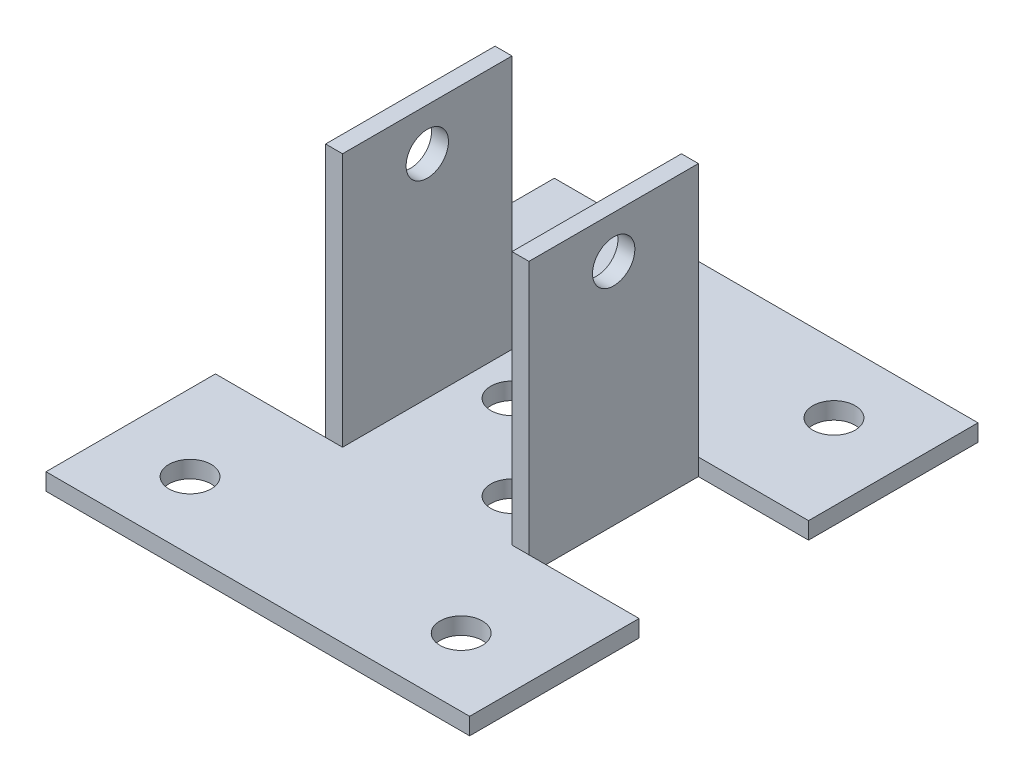
ISO-10303-21;
HEADER;
FILE_DESCRIPTION(('STEP AP214'),'2;1');
FILE_NAME('part.step','',(''),(''),'','','');
FILE_SCHEMA(('AUTOMOTIVE_DESIGN { 1 0 10303 214 1 1 1 1 }'));
ENDSEC;
DATA;
#1=APPLICATION_CONTEXT('core data for automotive mechanical design processes');
#2=APPLICATION_PROTOCOL_DEFINITION('international standard','automotive_design',2000,#1);
#3=PRODUCT_CONTEXT('',#1,'mechanical');
#4=PRODUCT('Part','Part','',(#3));
#5=PRODUCT_RELATED_PRODUCT_CATEGORY('part','',(#4));
#6=PRODUCT_DEFINITION_FORMATION('','',#4);
#7=PRODUCT_DEFINITION_CONTEXT('part definition',#1,'design');
#8=PRODUCT_DEFINITION('design','',#6,#7);
#9=PRODUCT_DEFINITION_SHAPE('','',#8);
#10=(LENGTH_UNIT() NAMED_UNIT(*) SI_UNIT(.MILLI.,.METRE.));
#11=(NAMED_UNIT(*) PLANE_ANGLE_UNIT() SI_UNIT($,.RADIAN.));
#12=(NAMED_UNIT(*) SI_UNIT($,.STERADIAN.) SOLID_ANGLE_UNIT());
#13=UNCERTAINTY_MEASURE_WITH_UNIT(LENGTH_MEASURE(1.E-05),#10,'distance_accuracy_value','');
#14=(GEOMETRIC_REPRESENTATION_CONTEXT(3) GLOBAL_UNCERTAINTY_ASSIGNED_CONTEXT((#13)) GLOBAL_UNIT_ASSIGNED_CONTEXT((#10,
#11,#12)) REPRESENTATION_CONTEXT('',''));
#15=CARTESIAN_POINT('',(0.,0.,0.));
#16=DIRECTION('',(0.,0.,1.));
#17=DIRECTION('',(1.,0.,0.));
#18=AXIS2_PLACEMENT_3D('',#15,#16,#17);
#19=CARTESIAN_POINT('',(10.,-2.,-10.));
#20=DIRECTION('',(0.,0.,1.));
#21=DIRECTION('',(1.,0.,0.));
#22=AXIS2_PLACEMENT_3D('',#19,#20,#21);
#23=PLANE('',#22);
#24=DIRECTION('',(0.,1.,0.));
#25=VECTOR('',#24,1.);
#26=CARTESIAN_POINT('',(12.,-2.,-10.));
#27=LINE('',#26,#25);
#28=CARTESIAN_POINT('',(12.,-2.,-10.));
#29=VERTEX_POINT('',#28);
#30=CARTESIAN_POINT('',(12.,0.,-10.));
#31=VERTEX_POINT('',#30);
#32=EDGE_CURVE('E307',#29,#31,#27,.T.);
#33=ORIENTED_EDGE('',*,*,#32,.F.);
#34=DIRECTION('',(1.,0.,0.));
#35=VECTOR('',#34,1.);
#36=CARTESIAN_POINT('',(10.,-2.,-10.));
#37=LINE('',#36,#35);
#38=CARTESIAN_POINT('',(25.,-2.,-10.));
#39=VERTEX_POINT('',#38);
#40=EDGE_CURVE('E102',#29,#39,#37,.T.);
#41=ORIENTED_EDGE('',*,*,#40,.T.);
#42=DIRECTION('',(0.,1.,0.));
#43=VECTOR('',#42,1.);
#44=CARTESIAN_POINT('',(25.,-2.,-10.));
#45=LINE('',#44,#43);
#46=CARTESIAN_POINT('',(25.,0.,-10.));
#47=VERTEX_POINT('',#46);
#48=EDGE_CURVE('E154',#39,#47,#45,.T.);
#49=ORIENTED_EDGE('',*,*,#48,.T.);
#50=DIRECTION('',(1.,0.,0.));
#51=VECTOR('',#50,1.);
#52=CARTESIAN_POINT('',(10.,0.,-10.));
#53=LINE('',#52,#51);
#54=EDGE_CURVE('E159',#31,#47,#53,.T.);
#55=ORIENTED_EDGE('',*,*,#54,.F.);
#56=EDGE_LOOP('',(#33,#41,#49,#55));
#57=FACE_BOUND('',#56,.T.);
#58=ADVANCED_FACE('F33',(#57),#23,.T.);
#59=CARTESIAN_POINT('',(10.,-2.,10.));
#60=DIRECTION('',(0.,0.,-1.));
#61=DIRECTION('',(-1.,0.,0.));
#62=AXIS2_PLACEMENT_3D('',#59,#60,#61);
#63=PLANE('',#62);
#64=DIRECTION('',(0.,1.,0.));
#65=VECTOR('',#64,1.);
#66=CARTESIAN_POINT('',(12.,-2.,10.));
#67=LINE('',#66,#65);
#68=CARTESIAN_POINT('',(12.,-2.,10.));
#69=VERTEX_POINT('',#68);
#70=CARTESIAN_POINT('',(12.,0.,10.));
#71=VERTEX_POINT('',#70);
#72=EDGE_CURVE('E546',#69,#71,#67,.T.);
#73=ORIENTED_EDGE('',*,*,#72,.T.);
#74=DIRECTION('',(-1.,0.,0.));
#75=VECTOR('',#74,1.);
#76=CARTESIAN_POINT('',(10.,0.,10.));
#77=LINE('',#76,#75);
#78=CARTESIAN_POINT('',(25.,0.,10.));
#79=VERTEX_POINT('',#78);
#80=EDGE_CURVE('E186',#79,#71,#77,.T.);
#81=ORIENTED_EDGE('',*,*,#80,.F.);
#82=DIRECTION('',(0.,1.,0.));
#83=VECTOR('',#82,1.);
#84=CARTESIAN_POINT('',(25.,-2.,10.));
#85=LINE('',#84,#83);
#86=CARTESIAN_POINT('',(25.,-2.,10.));
#87=VERTEX_POINT('',#86);
#88=EDGE_CURVE('E11',#87,#79,#85,.T.);
#89=ORIENTED_EDGE('',*,*,#88,.F.);
#90=DIRECTION('',(-1.,0.,0.));
#91=VECTOR('',#90,1.);
#92=CARTESIAN_POINT('',(10.,-2.,10.));
#93=LINE('',#92,#91);
#94=EDGE_CURVE('E152',#87,#69,#93,.T.);
#95=ORIENTED_EDGE('',*,*,#94,.T.);
#96=EDGE_LOOP('',(#73,#81,#89,#95));
#97=FACE_BOUND('',#96,.T.);
#98=ADVANCED_FACE('F335',(#97),#63,.T.);
#99=CARTESIAN_POINT('',(25.,-2.,10.));
#100=DIRECTION('',(1.,0.,0.));
#101=DIRECTION('',(0.,0.,-1.));
#102=AXIS2_PLACEMENT_3D('',#99,#100,#101);
#103=PLANE('',#102);
#104=DIRECTION('',(0.,0.,-1.));
#105=VECTOR('',#104,1.);
#106=CARTESIAN_POINT('',(25.,0.,10.));
#107=LINE('',#106,#105);
#108=CARTESIAN_POINT('',(25.,0.,30.));
#109=VERTEX_POINT('',#108);
#110=EDGE_CURVE('E182',#109,#79,#107,.T.);
#111=ORIENTED_EDGE('',*,*,#110,.F.);
#112=DIRECTION('',(0.,1.,0.));
#113=VECTOR('',#112,1.);
#114=CARTESIAN_POINT('',(25.,-2.,30.));
#115=LINE('',#114,#113);
#116=CARTESIAN_POINT('',(25.,-2.,30.));
#117=VERTEX_POINT('',#116);
#118=EDGE_CURVE('E41',#117,#109,#115,.T.);
#119=ORIENTED_EDGE('',*,*,#118,.F.);
#120=DIRECTION('',(0.,0.,-1.));
#121=VECTOR('',#120,1.);
#122=CARTESIAN_POINT('',(25.,-2.,10.));
#123=LINE('',#122,#121);
#124=EDGE_CURVE('E140',#117,#87,#123,.T.);
#125=ORIENTED_EDGE('',*,*,#124,.T.);
#126=ORIENTED_EDGE('',*,*,#88,.T.);
#127=EDGE_LOOP('',(#111,#119,#125,#126));
#128=FACE_BOUND('',#127,.T.);
#129=ADVANCED_FACE('F339',(#128),#103,.T.);
#130=CARTESIAN_POINT('',(25.,-2.,30.));
#131=DIRECTION('',(0.,0.,1.));
#132=DIRECTION('',(1.,0.,0.));
#133=AXIS2_PLACEMENT_3D('',#130,#131,#132);
#134=PLANE('',#133);
#135=DIRECTION('',(1.,0.,0.));
#136=VECTOR('',#135,1.);
#137=CARTESIAN_POINT('',(25.,0.,30.));
#138=LINE('',#137,#136);
#139=CARTESIAN_POINT('',(-25.,0.,30.));
#140=VERTEX_POINT('',#139);
#141=EDGE_CURVE('E126',#140,#109,#138,.T.);
#142=ORIENTED_EDGE('',*,*,#141,.F.);
#143=DIRECTION('',(0.,1.,0.));
#144=VECTOR('',#143,1.);
#145=CARTESIAN_POINT('',(-25.,-2.,30.));
#146=LINE('',#145,#144);
#147=CARTESIAN_POINT('',(-25.,-2.,30.));
#148=VERTEX_POINT('',#147);
#149=EDGE_CURVE('E121',#148,#140,#146,.T.);
#150=ORIENTED_EDGE('',*,*,#149,.F.);
#151=DIRECTION('',(1.,0.,0.));
#152=VECTOR('',#151,1.);
#153=CARTESIAN_POINT('',(25.,-2.,30.));
#154=LINE('',#153,#152);
#155=EDGE_CURVE('E124',#148,#117,#154,.T.);
#156=ORIENTED_EDGE('',*,*,#155,.T.);
#157=ORIENTED_EDGE('',*,*,#118,.T.);
#158=EDGE_LOOP('',(#142,#150,#156,#157));
#159=FACE_BOUND('',#158,.T.);
#160=ADVANCED_FACE('F123',(#159),#134,.T.);
#161=CARTESIAN_POINT('',(-25.,-2.,30.));
#162=DIRECTION('',(-1.,0.,0.));
#163=DIRECTION('',(0.,0.,1.));
#164=AXIS2_PLACEMENT_3D('',#161,#162,#163);
#165=PLANE('',#164);
#166=DIRECTION('',(0.,0.,1.));
#167=VECTOR('',#166,1.);
#168=CARTESIAN_POINT('',(-25.,0.,30.));
#169=LINE('',#168,#167);
#170=CARTESIAN_POINT('',(-25.,0.,10.));
#171=VERTEX_POINT('',#170);
#172=EDGE_CURVE('E179',#171,#140,#169,.T.);
#173=ORIENTED_EDGE('',*,*,#172,.F.);
#174=DIRECTION('',(0.,1.,0.));
#175=VECTOR('',#174,1.);
#176=CARTESIAN_POINT('',(-25.,-2.,10.));
#177=LINE('',#176,#175);
#178=CARTESIAN_POINT('',(-25.,-2.,10.));
#179=VERTEX_POINT('',#178);
#180=EDGE_CURVE('E131',#179,#171,#177,.T.);
#181=ORIENTED_EDGE('',*,*,#180,.F.);
#182=DIRECTION('',(0.,0.,1.));
#183=VECTOR('',#182,1.);
#184=CARTESIAN_POINT('',(-25.,-2.,30.));
#185=LINE('',#184,#183);
#186=EDGE_CURVE('E138',#179,#148,#185,.T.);
#187=ORIENTED_EDGE('',*,*,#186,.T.);
#188=ORIENTED_EDGE('',*,*,#149,.T.);
#189=EDGE_LOOP('',(#173,#181,#187,#188));
#190=FACE_BOUND('',#189,.T.);
#191=ADVANCED_FACE('F143',(#190),#165,.T.);
#192=CARTESIAN_POINT('',(-25.,-2.,10.));
#193=DIRECTION('',(0.,0.,-1.));
#194=DIRECTION('',(-1.,0.,0.));
#195=AXIS2_PLACEMENT_3D('',#192,#193,#194);
#196=PLANE('',#195);
#197=DIRECTION('',(0.,1.,0.));
#198=VECTOR('',#197,1.);
#199=CARTESIAN_POINT('',(-12.,-2.,10.));
#200=LINE('',#199,#198);
#201=CARTESIAN_POINT('',(-12.,-2.,10.));
#202=VERTEX_POINT('',#201);
#203=CARTESIAN_POINT('',(-12.,0.,10.));
#204=VERTEX_POINT('',#203);
#205=EDGE_CURVE('E49',#202,#204,#200,.T.);
#206=ORIENTED_EDGE('',*,*,#205,.F.);
#207=DIRECTION('',(-1.,0.,0.));
#208=VECTOR('',#207,1.);
#209=CARTESIAN_POINT('',(-25.,-2.,10.));
#210=LINE('',#209,#208);
#211=EDGE_CURVE('E145',#202,#179,#210,.T.);
#212=ORIENTED_EDGE('',*,*,#211,.T.);
#213=ORIENTED_EDGE('',*,*,#180,.T.);
#214=DIRECTION('',(-1.,0.,0.));
#215=VECTOR('',#214,1.);
#216=CARTESIAN_POINT('',(-25.,0.,10.));
#217=LINE('',#216,#215);
#218=EDGE_CURVE('E175',#204,#171,#217,.T.);
#219=ORIENTED_EDGE('',*,*,#218,.F.);
#220=EDGE_LOOP('',(#206,#212,#213,#219));
#221=FACE_BOUND('',#220,.T.);
#222=ADVANCED_FACE('F316',(#221),#196,.T.);
#223=CARTESIAN_POINT('',(-25.,-2.,-10.));
#224=DIRECTION('',(0.,0.,1.));
#225=DIRECTION('',(1.,0.,0.));
#226=AXIS2_PLACEMENT_3D('',#223,#224,#225);
#227=PLANE('',#226);
#228=DIRECTION('',(0.,1.,0.));
#229=VECTOR('',#228,1.);
#230=CARTESIAN_POINT('',(-12.,-2.,-10.));
#231=LINE('',#230,#229);
#232=CARTESIAN_POINT('',(-12.,-2.,-10.));
#233=VERTEX_POINT('',#232);
#234=CARTESIAN_POINT('',(-12.,0.,-10.));
#235=VERTEX_POINT('',#234);
#236=EDGE_CURVE('E210',#233,#235,#231,.T.);
#237=ORIENTED_EDGE('',*,*,#236,.T.);
#238=DIRECTION('',(1.,0.,0.));
#239=VECTOR('',#238,1.);
#240=CARTESIAN_POINT('',(-25.,0.,-10.));
#241=LINE('',#240,#239);
#242=CARTESIAN_POINT('',(-25.,0.,-10.));
#243=VERTEX_POINT('',#242);
#244=EDGE_CURVE('E169',#243,#235,#241,.T.);
#245=ORIENTED_EDGE('',*,*,#244,.F.);
#246=DIRECTION('',(0.,1.,0.));
#247=VECTOR('',#246,1.);
#248=CARTESIAN_POINT('',(-25.,-2.,-10.));
#249=LINE('',#248,#247);
#250=CARTESIAN_POINT('',(-25.,-2.,-10.));
#251=VERTEX_POINT('',#250);
#252=EDGE_CURVE('E194',#251,#243,#249,.T.);
#253=ORIENTED_EDGE('',*,*,#252,.F.);
#254=DIRECTION('',(1.,0.,0.));
#255=VECTOR('',#254,1.);
#256=CARTESIAN_POINT('',(-25.,-2.,-10.));
#257=LINE('',#256,#255);
#258=EDGE_CURVE('E147',#251,#233,#257,.T.);
#259=ORIENTED_EDGE('',*,*,#258,.T.);
#260=EDGE_LOOP('',(#237,#245,#253,#259));
#261=FACE_BOUND('',#260,.T.);
#262=ADVANCED_FACE('F241',(#261),#227,.T.);
#263=CARTESIAN_POINT('',(-25.,-2.,-30.));
#264=DIRECTION('',(-1.,0.,0.));
#265=DIRECTION('',(0.,0.,1.));
#266=AXIS2_PLACEMENT_3D('',#263,#264,#265);
#267=PLANE('',#266);
#268=DIRECTION('',(0.,0.,1.));
#269=VECTOR('',#268,1.);
#270=CARTESIAN_POINT('',(-25.,0.,-30.));
#271=LINE('',#270,#269);
#272=CARTESIAN_POINT('',(-25.,0.,-30.));
#273=VERTEX_POINT('',#272);
#274=EDGE_CURVE('E165',#273,#243,#271,.T.);
#275=ORIENTED_EDGE('',*,*,#274,.F.);
#276=DIRECTION('',(0.,1.,0.));
#277=VECTOR('',#276,1.);
#278=CARTESIAN_POINT('',(-25.,-2.,-30.));
#279=LINE('',#278,#277);
#280=CARTESIAN_POINT('',(-25.,-2.,-30.));
#281=VERTEX_POINT('',#280);
#282=EDGE_CURVE('E196',#281,#273,#279,.T.);
#283=ORIENTED_EDGE('',*,*,#282,.F.);
#284=DIRECTION('',(0.,0.,1.));
#285=VECTOR('',#284,1.);
#286=CARTESIAN_POINT('',(-25.,-2.,-30.));
#287=LINE('',#286,#285);
#288=EDGE_CURVE('E237',#281,#251,#287,.T.);
#289=ORIENTED_EDGE('',*,*,#288,.T.);
#290=ORIENTED_EDGE('',*,*,#252,.T.);
#291=EDGE_LOOP('',(#275,#283,#289,#290));
#292=FACE_BOUND('',#291,.T.);
#293=ADVANCED_FACE('F250',(#292),#267,.T.);
#294=CARTESIAN_POINT('',(25.,-2.,-30.));
#295=DIRECTION('',(0.,0.,-1.));
#296=DIRECTION('',(-1.,0.,0.));
#297=AXIS2_PLACEMENT_3D('',#294,#295,#296);
#298=PLANE('',#297);
#299=DIRECTION('',(-1.,0.,0.));
#300=VECTOR('',#299,1.);
#301=CARTESIAN_POINT('',(25.,0.,-30.));
#302=LINE('',#301,#300);
#303=CARTESIAN_POINT('',(25.,0.,-30.));
#304=VERTEX_POINT('',#303);
#305=EDGE_CURVE('E162',#304,#273,#302,.T.);
#306=ORIENTED_EDGE('',*,*,#305,.F.);
#307=DIRECTION('',(0.,1.,0.));
#308=VECTOR('',#307,1.);
#309=CARTESIAN_POINT('',(25.,-2.,-30.));
#310=LINE('',#309,#308);
#311=CARTESIAN_POINT('',(25.,-2.,-30.));
#312=VERTEX_POINT('',#311);
#313=EDGE_CURVE('E198',#312,#304,#310,.T.);
#314=ORIENTED_EDGE('',*,*,#313,.F.);
#315=DIRECTION('',(-1.,0.,0.));
#316=VECTOR('',#315,1.);
#317=CARTESIAN_POINT('',(25.,-2.,-30.));
#318=LINE('',#317,#316);
#319=EDGE_CURVE('E234',#312,#281,#318,.T.);
#320=ORIENTED_EDGE('',*,*,#319,.T.);
#321=ORIENTED_EDGE('',*,*,#282,.T.);
#322=EDGE_LOOP('',(#306,#314,#320,#321));
#323=FACE_BOUND('',#322,.T.);
#324=ADVANCED_FACE('F252',(#323),#298,.T.);
#325=CARTESIAN_POINT('',(25.,-2.,-10.));
#326=DIRECTION('',(1.,0.,0.));
#327=DIRECTION('',(0.,0.,-1.));
#328=AXIS2_PLACEMENT_3D('',#325,#326,#327);
#329=PLANE('',#328);
#330=DIRECTION('',(0.,0.,-1.));
#331=VECTOR('',#330,1.);
#332=CARTESIAN_POINT('',(25.,0.,-10.));
#333=LINE('',#332,#331);
#334=EDGE_CURVE('E158',#47,#304,#333,.T.);
#335=ORIENTED_EDGE('',*,*,#334,.F.);
#336=ORIENTED_EDGE('',*,*,#48,.F.);
#337=DIRECTION('',(0.,0.,-1.));
#338=VECTOR('',#337,1.);
#339=CARTESIAN_POINT('',(25.,-2.,-10.));
#340=LINE('',#339,#338);
#341=EDGE_CURVE('E232',#39,#312,#340,.T.);
#342=ORIENTED_EDGE('',*,*,#341,.T.);
#343=ORIENTED_EDGE('',*,*,#313,.T.);
#344=EDGE_LOOP('',(#335,#336,#342,#343));
#345=FACE_BOUND('',#344,.T.);
#346=ADVANCED_FACE('F205',(#345),#329,.T.);
#347=CARTESIAN_POINT('',(0.,-2.,0.));
#348=DIRECTION('',(0.,1.,0.));
#349=DIRECTION('',(0.,0.,1.));
#350=AXIS2_PLACEMENT_3D('',#347,#348,#349);
#351=PLANE('',#350);
#352=CARTESIAN_POINT('',(16.,-2.,-22.));
#353=DIRECTION('',(0.,1.,0.));
#354=DIRECTION('',(0.,0.,1.));
#355=AXIS2_PLACEMENT_3D('',#352,#353,#354);
#356=CIRCLE('',#355,2.5);
#357=CARTESIAN_POINT('',(16.,-2.,-19.5));
#358=VERTEX_POINT('',#357);
#359=EDGE_CURVE('E577',#358,#358,#356,.T.);
#360=ORIENTED_EDGE('',*,*,#359,.T.);
#361=EDGE_LOOP('',(#360));
#362=FACE_BOUND('',#361,.T.);
#363=CARTESIAN_POINT('',(-16.,-2.,-22.));
#364=DIRECTION('',(0.,1.,0.));
#365=DIRECTION('',(0.,0.,1.));
#366=AXIS2_PLACEMENT_3D('',#363,#364,#365);
#367=CIRCLE('',#366,2.5);
#368=CARTESIAN_POINT('',(-16.,-2.,-19.5));
#369=VERTEX_POINT('',#368);
#370=EDGE_CURVE('E583',#369,#369,#367,.T.);
#371=ORIENTED_EDGE('',*,*,#370,.T.);
#372=EDGE_LOOP('',(#371));
#373=FACE_BOUND('',#372,.T.);
#374=CARTESIAN_POINT('',(-5.,-2.,-5.));
#375=DIRECTION('',(0.,1.,0.));
#376=DIRECTION('',(0.,0.,1.));
#377=AXIS2_PLACEMENT_3D('',#374,#375,#376);
#378=CIRCLE('',#377,2.5);
#379=CARTESIAN_POINT('',(-5.,-2.,-2.5));
#380=VERTEX_POINT('',#379);
#381=EDGE_CURVE('E589',#380,#380,#378,.T.);
#382=ORIENTED_EDGE('',*,*,#381,.T.);
#383=EDGE_LOOP('',(#382));
#384=FACE_BOUND('',#383,.T.);
#385=CARTESIAN_POINT('',(5.,-2.,5.));
#386=DIRECTION('',(0.,1.,0.));
#387=DIRECTION('',(0.,0.,1.));
#388=AXIS2_PLACEMENT_3D('',#385,#386,#387);
#389=CIRCLE('',#388,2.5);
#390=CARTESIAN_POINT('',(5.,-2.,7.5));
#391=VERTEX_POINT('',#390);
#392=EDGE_CURVE('E595',#391,#391,#389,.T.);
#393=ORIENTED_EDGE('',*,*,#392,.T.);
#394=EDGE_LOOP('',(#393));
#395=FACE_BOUND('',#394,.T.);
#396=CARTESIAN_POINT('',(-16.,-2.,22.));
#397=DIRECTION('',(0.,1.,0.));
#398=DIRECTION('',(0.,0.,1.));
#399=AXIS2_PLACEMENT_3D('',#396,#397,#398);
#400=CIRCLE('',#399,2.5);
#401=CARTESIAN_POINT('',(-16.,-2.,24.5));
#402=VERTEX_POINT('',#401);
#403=EDGE_CURVE('E571',#402,#402,#400,.T.);
#404=ORIENTED_EDGE('',*,*,#403,.T.);
#405=EDGE_LOOP('',(#404));
#406=FACE_BOUND('',#405,.T.);
#407=CARTESIAN_POINT('',(16.,-2.,22.));
#408=DIRECTION('',(0.,1.,0.));
#409=DIRECTION('',(0.,0.,1.));
#410=AXIS2_PLACEMENT_3D('',#407,#408,#409);
#411=CIRCLE('',#410,2.5);
#412=CARTESIAN_POINT('',(16.,-2.,24.5));
#413=VERTEX_POINT('',#412);
#414=EDGE_CURVE('E567',#413,#413,#411,.T.);
#415=ORIENTED_EDGE('',*,*,#414,.T.);
#416=EDGE_LOOP('',(#415));
#417=FACE_BOUND('',#416,.T.);
#418=ORIENTED_EDGE('',*,*,#40,.F.);
#419=DIRECTION('',(0.,0.,-1.));
#420=VECTOR('',#419,1.);
#421=CARTESIAN_POINT('',(12.,-2.,-10.));
#422=LINE('',#421,#420);
#423=EDGE_CURVE('E257',#69,#29,#422,.T.);
#424=ORIENTED_EDGE('',*,*,#423,.F.);
#425=ORIENTED_EDGE('',*,*,#94,.F.);
#426=ORIENTED_EDGE('',*,*,#124,.F.);
#427=ORIENTED_EDGE('',*,*,#155,.F.);
#428=ORIENTED_EDGE('',*,*,#186,.F.);
#429=ORIENTED_EDGE('',*,*,#211,.F.);
#430=DIRECTION('',(0.,0.,1.));
#431=VECTOR('',#430,1.);
#432=CARTESIAN_POINT('',(-12.,-2.,10.));
#433=LINE('',#432,#431);
#434=EDGE_CURVE('E222',#233,#202,#433,.T.);
#435=ORIENTED_EDGE('',*,*,#434,.F.);
#436=ORIENTED_EDGE('',*,*,#258,.F.);
#437=ORIENTED_EDGE('',*,*,#288,.F.);
#438=ORIENTED_EDGE('',*,*,#319,.F.);
#439=ORIENTED_EDGE('',*,*,#341,.F.);
#440=EDGE_LOOP('',(#418,#424,#425,#426,#427,#428,#429,#435,#436,#437,#438,#439));
#441=FACE_BOUND('',#440,.T.);
#442=ADVANCED_FACE('F136',(#362,#373,#384,#395,#406,#417,#441),#351,.F.);
#443=CARTESIAN_POINT('',(0.,0.,0.));
#444=DIRECTION('',(0.,1.,0.));
#445=DIRECTION('',(0.,0.,1.));
#446=AXIS2_PLACEMENT_3D('',#443,#444,#445);
#447=PLANE('',#446);
#448=CARTESIAN_POINT('',(16.,0.,-22.));
#449=DIRECTION('',(0.,1.,0.));
#450=DIRECTION('',(0.,0.,1.));
#451=AXIS2_PLACEMENT_3D('',#448,#449,#450);
#452=CIRCLE('',#451,2.5);
#453=CARTESIAN_POINT('',(16.,0.,-19.5));
#454=VERTEX_POINT('',#453);
#455=EDGE_CURVE('E574',#454,#454,#452,.T.);
#456=ORIENTED_EDGE('',*,*,#455,.F.);
#457=EDGE_LOOP('',(#456));
#458=FACE_BOUND('',#457,.T.);
#459=CARTESIAN_POINT('',(-16.,0.,-22.));
#460=DIRECTION('',(0.,1.,0.));
#461=DIRECTION('',(0.,0.,1.));
#462=AXIS2_PLACEMENT_3D('',#459,#460,#461);
#463=CIRCLE('',#462,2.5);
#464=CARTESIAN_POINT('',(-16.,0.,-19.5));
#465=VERTEX_POINT('',#464);
#466=EDGE_CURVE('E580',#465,#465,#463,.T.);
#467=ORIENTED_EDGE('',*,*,#466,.F.);
#468=EDGE_LOOP('',(#467));
#469=FACE_BOUND('',#468,.T.);
#470=CARTESIAN_POINT('',(-5.,0.,-5.));
#471=DIRECTION('',(0.,1.,0.));
#472=DIRECTION('',(0.,0.,1.));
#473=AXIS2_PLACEMENT_3D('',#470,#471,#472);
#474=CIRCLE('',#473,2.5);
#475=CARTESIAN_POINT('',(-5.,0.,-2.5));
#476=VERTEX_POINT('',#475);
#477=EDGE_CURVE('E586',#476,#476,#474,.T.);
#478=ORIENTED_EDGE('',*,*,#477,.F.);
#479=EDGE_LOOP('',(#478));
#480=FACE_BOUND('',#479,.T.);
#481=CARTESIAN_POINT('',(5.,0.,5.));
#482=DIRECTION('',(0.,1.,0.));
#483=DIRECTION('',(0.,0.,1.));
#484=AXIS2_PLACEMENT_3D('',#481,#482,#483);
#485=CIRCLE('',#484,2.5);
#486=CARTESIAN_POINT('',(5.,0.,7.5));
#487=VERTEX_POINT('',#486);
#488=EDGE_CURVE('E592',#487,#487,#485,.T.);
#489=ORIENTED_EDGE('',*,*,#488,.F.);
#490=EDGE_LOOP('',(#489));
#491=FACE_BOUND('',#490,.T.);
#492=CARTESIAN_POINT('',(-16.,0.,22.));
#493=DIRECTION('',(0.,1.,0.));
#494=DIRECTION('',(0.,0.,1.));
#495=AXIS2_PLACEMENT_3D('',#492,#493,#494);
#496=CIRCLE('',#495,2.5);
#497=CARTESIAN_POINT('',(-16.,0.,24.5));
#498=VERTEX_POINT('',#497);
#499=EDGE_CURVE('E598',#498,#498,#496,.T.);
#500=ORIENTED_EDGE('',*,*,#499,.F.);
#501=EDGE_LOOP('',(#500));
#502=FACE_BOUND('',#501,.T.);
#503=CARTESIAN_POINT('',(16.,0.,22.));
#504=DIRECTION('',(0.,1.,0.));
#505=DIRECTION('',(0.,0.,1.));
#506=AXIS2_PLACEMENT_3D('',#503,#504,#505);
#507=CIRCLE('',#506,2.5);
#508=CARTESIAN_POINT('',(16.,0.,24.5));
#509=VERTEX_POINT('',#508);
#510=EDGE_CURVE('E568',#509,#509,#507,.T.);
#511=ORIENTED_EDGE('',*,*,#510,.F.);
#512=EDGE_LOOP('',(#511));
#513=FACE_BOUND('',#512,.T.);
#514=CARTESIAN_POINT('',(10.,0.,-10.));
#515=VERTEX_POINT('',#514);
#516=EDGE_CURVE('E155',#515,#31,#53,.T.);
#517=ORIENTED_EDGE('',*,*,#516,.T.);
#518=ORIENTED_EDGE('',*,*,#54,.T.);
#519=ORIENTED_EDGE('',*,*,#334,.T.);
#520=ORIENTED_EDGE('',*,*,#305,.T.);
#521=ORIENTED_EDGE('',*,*,#274,.T.);
#522=ORIENTED_EDGE('',*,*,#244,.T.);
#523=CARTESIAN_POINT('',(-10.,0.,-10.));
#524=VERTEX_POINT('',#523);
#525=EDGE_CURVE('E168',#235,#524,#241,.T.);
#526=ORIENTED_EDGE('',*,*,#525,.T.);
#527=DIRECTION('',(0.,0.,1.));
#528=VECTOR('',#527,1.);
#529=CARTESIAN_POINT('',(-10.,0.,10.));
#530=LINE('',#529,#528);
#531=CARTESIAN_POINT('',(-10.,0.,10.));
#532=VERTEX_POINT('',#531);
#533=EDGE_CURVE('E172',#524,#532,#530,.T.);
#534=ORIENTED_EDGE('',*,*,#533,.T.);
#535=EDGE_CURVE('E176',#532,#204,#217,.T.);
#536=ORIENTED_EDGE('',*,*,#535,.T.);
#537=ORIENTED_EDGE('',*,*,#218,.T.);
#538=ORIENTED_EDGE('',*,*,#172,.T.);
#539=ORIENTED_EDGE('',*,*,#141,.T.);
#540=ORIENTED_EDGE('',*,*,#110,.T.);
#541=ORIENTED_EDGE('',*,*,#80,.T.);
#542=CARTESIAN_POINT('',(10.,0.,10.));
#543=VERTEX_POINT('',#542);
#544=EDGE_CURVE('E185',#71,#543,#77,.T.);
#545=ORIENTED_EDGE('',*,*,#544,.T.);
#546=DIRECTION('',(0.,0.,-1.));
#547=VECTOR('',#546,1.);
#548=CARTESIAN_POINT('',(10.,0.,-10.));
#549=LINE('',#548,#547);
#550=EDGE_CURVE('E189',#543,#515,#549,.T.);
#551=ORIENTED_EDGE('',*,*,#550,.T.);
#552=EDGE_LOOP('',(#517,#518,#519,#520,#521,#522,#526,#534,#536,#537,#538,#539,#540,#541,#545,#551));
#553=FACE_BOUND('',#552,.T.);
#554=ADVANCED_FACE('F208',(#458,#469,#480,#491,#502,#513,#553),#447,.T.);
#555=CARTESIAN_POINT('',(-12.,-2.,10.));
#556=DIRECTION('',(-1.,0.,0.));
#557=DIRECTION('',(0.,0.,1.));
#558=AXIS2_PLACEMENT_3D('',#555,#556,#557);
#559=PLANE('',#558);
#560=CARTESIAN_POINT('',(-12.,25.,0.));
#561=DIRECTION('',(-1.,0.,0.));
#562=DIRECTION('',(0.,0.,1.));
#563=AXIS2_PLACEMENT_3D('',#560,#561,#562);
#564=CIRCLE('',#563,2.5);
#565=CARTESIAN_POINT('',(-12.,25.,2.5));
#566=VERTEX_POINT('',#565);
#567=EDGE_CURVE('E578',#566,#566,#564,.T.);
#568=ORIENTED_EDGE('',*,*,#567,.F.);
#569=EDGE_LOOP('',(#568));
#570=FACE_BOUND('',#569,.T.);
#571=ORIENTED_EDGE('',*,*,#205,.T.);
#572=CARTESIAN_POINT('',(-12.,30.,10.));
#573=VERTEX_POINT('',#572);
#574=EDGE_CURVE('E230',#204,#573,#200,.T.);
#575=ORIENTED_EDGE('',*,*,#574,.T.);
#576=DIRECTION('',(0.,0.,1.));
#577=VECTOR('',#576,1.);
#578=CARTESIAN_POINT('',(-12.,30.,10.));
#579=LINE('',#578,#577);
#580=CARTESIAN_POINT('',(-12.,30.,-10.));
#581=VERTEX_POINT('',#580);
#582=EDGE_CURVE('E297',#581,#573,#579,.T.);
#583=ORIENTED_EDGE('',*,*,#582,.F.);
#584=EDGE_CURVE('E212',#235,#581,#231,.T.);
#585=ORIENTED_EDGE('',*,*,#584,.F.);
#586=ORIENTED_EDGE('',*,*,#236,.F.);
#587=ORIENTED_EDGE('',*,*,#434,.T.);
#588=EDGE_LOOP('',(#571,#575,#583,#585,#586,#587));
#589=FACE_BOUND('',#588,.T.);
#590=ADVANCED_FACE('F295',(#570,#589),#559,.T.);
#591=CARTESIAN_POINT('',(-12.,-2.,-10.));
#592=DIRECTION('',(0.,0.,-1.));
#593=DIRECTION('',(-1.,0.,0.));
#594=AXIS2_PLACEMENT_3D('',#591,#592,#593);
#595=PLANE('',#594);
#596=DIRECTION('',(0.,1.,0.));
#597=VECTOR('',#596,1.);
#598=CARTESIAN_POINT('',(-10.,-2.,-10.));
#599=LINE('',#598,#597);
#600=CARTESIAN_POINT('',(-10.,30.,-10.));
#601=VERTEX_POINT('',#600);
#602=EDGE_CURVE('E219',#524,#601,#599,.T.);
#603=ORIENTED_EDGE('',*,*,#602,.F.);
#604=ORIENTED_EDGE('',*,*,#525,.F.);
#605=ORIENTED_EDGE('',*,*,#584,.T.);
#606=DIRECTION('',(-1.,0.,0.));
#607=VECTOR('',#606,1.);
#608=CARTESIAN_POINT('',(-12.,30.,-10.));
#609=LINE('',#608,#607);
#610=EDGE_CURVE('E313',#601,#581,#609,.T.);
#611=ORIENTED_EDGE('',*,*,#610,.F.);
#612=EDGE_LOOP('',(#603,#604,#605,#611));
#613=FACE_BOUND('',#612,.T.);
#614=ADVANCED_FACE('F291',(#613),#595,.T.);
#615=CARTESIAN_POINT('',(-10.,-2.,-10.));
#616=DIRECTION('',(1.,0.,0.));
#617=DIRECTION('',(0.,0.,-1.));
#618=AXIS2_PLACEMENT_3D('',#615,#616,#617);
#619=PLANE('',#618);
#620=CARTESIAN_POINT('',(-10.,25.,0.));
#621=DIRECTION('',(1.,0.,0.));
#622=DIRECTION('',(0.,0.,-1.));
#623=AXIS2_PLACEMENT_3D('',#620,#621,#622);
#624=CIRCLE('',#623,2.5);
#625=CARTESIAN_POINT('',(-10.,25.,-2.5));
#626=VERTEX_POINT('',#625);
#627=EDGE_CURVE('E604',#626,#626,#624,.T.);
#628=ORIENTED_EDGE('',*,*,#627,.F.);
#629=EDGE_LOOP('',(#628));
#630=FACE_BOUND('',#629,.T.);
#631=DIRECTION('',(0.,1.,0.));
#632=VECTOR('',#631,1.);
#633=CARTESIAN_POINT('',(-10.,-2.,10.));
#634=LINE('',#633,#632);
#635=CARTESIAN_POINT('',(-10.,30.,10.));
#636=VERTEX_POINT('',#635);
#637=EDGE_CURVE('E226',#532,#636,#634,.T.);
#638=ORIENTED_EDGE('',*,*,#637,.F.);
#639=ORIENTED_EDGE('',*,*,#533,.F.);
#640=ORIENTED_EDGE('',*,*,#602,.T.);
#641=DIRECTION('',(0.,0.,-1.));
#642=VECTOR('',#641,1.);
#643=CARTESIAN_POINT('',(-10.,30.,-10.));
#644=LINE('',#643,#642);
#645=EDGE_CURVE('E304',#636,#601,#644,.T.);
#646=ORIENTED_EDGE('',*,*,#645,.F.);
#647=EDGE_LOOP('',(#638,#639,#640,#646));
#648=FACE_BOUND('',#647,.T.);
#649=ADVANCED_FACE('F320',(#630,#648),#619,.T.);
#650=CARTESIAN_POINT('',(-10.,-2.,10.));
#651=DIRECTION('',(0.,0.,1.));
#652=DIRECTION('',(1.,0.,0.));
#653=AXIS2_PLACEMENT_3D('',#650,#651,#652);
#654=PLANE('',#653);
#655=ORIENTED_EDGE('',*,*,#574,.F.);
#656=ORIENTED_EDGE('',*,*,#535,.F.);
#657=ORIENTED_EDGE('',*,*,#637,.T.);
#658=DIRECTION('',(1.,0.,0.));
#659=VECTOR('',#658,1.);
#660=CARTESIAN_POINT('',(-10.,30.,10.));
#661=LINE('',#660,#659);
#662=EDGE_CURVE('E301',#573,#636,#661,.T.);
#663=ORIENTED_EDGE('',*,*,#662,.F.);
#664=EDGE_LOOP('',(#655,#656,#657,#663));
#665=FACE_BOUND('',#664,.T.);
#666=ADVANCED_FACE('F318',(#665),#654,.T.);
#667=CARTESIAN_POINT('',(0.,30.,0.));
#668=DIRECTION('',(0.,-1.,0.));
#669=DIRECTION('',(0.,0.,-1.));
#670=AXIS2_PLACEMENT_3D('',#667,#668,#669);
#671=PLANE('',#670);
#672=ORIENTED_EDGE('',*,*,#582,.T.);
#673=ORIENTED_EDGE('',*,*,#662,.T.);
#674=ORIENTED_EDGE('',*,*,#645,.T.);
#675=ORIENTED_EDGE('',*,*,#610,.T.);
#676=EDGE_LOOP('',(#672,#673,#674,#675));
#677=FACE_BOUND('',#676,.T.);
#678=ADVANCED_FACE('F321',(#677),#671,.F.);
#679=CARTESIAN_POINT('',(10.,-2.,10.));
#680=DIRECTION('',(-1.,0.,0.));
#681=DIRECTION('',(0.,0.,1.));
#682=AXIS2_PLACEMENT_3D('',#679,#680,#681);
#683=PLANE('',#682);
#684=CARTESIAN_POINT('',(10.,25.,0.));
#685=DIRECTION('',(-1.,0.,0.));
#686=DIRECTION('',(0.,0.,1.));
#687=AXIS2_PLACEMENT_3D('',#684,#685,#686);
#688=CIRCLE('',#687,2.5);
#689=CARTESIAN_POINT('',(10.,25.,2.5));
#690=VERTEX_POINT('',#689);
#691=EDGE_CURVE('E607',#690,#690,#688,.T.);
#692=ORIENTED_EDGE('',*,*,#691,.F.);
#693=EDGE_LOOP('',(#692));
#694=FACE_BOUND('',#693,.T.);
#695=DIRECTION('',(0.,1.,0.));
#696=VECTOR('',#695,1.);
#697=CARTESIAN_POINT('',(10.,-2.,-10.));
#698=LINE('',#697,#696);
#699=CARTESIAN_POINT('',(10.,30.,-10.));
#700=VERTEX_POINT('',#699);
#701=EDGE_CURVE('E302',#515,#700,#698,.T.);
#702=ORIENTED_EDGE('',*,*,#701,.F.);
#703=ORIENTED_EDGE('',*,*,#550,.F.);
#704=DIRECTION('',(0.,1.,0.));
#705=VECTOR('',#704,1.);
#706=CARTESIAN_POINT('',(10.,-2.,10.));
#707=LINE('',#706,#705);
#708=CARTESIAN_POINT('',(10.,30.,10.));
#709=VERTEX_POINT('',#708);
#710=EDGE_CURVE('E93',#543,#709,#707,.T.);
#711=ORIENTED_EDGE('',*,*,#710,.T.);
#712=DIRECTION('',(0.,0.,1.));
#713=VECTOR('',#712,1.);
#714=CARTESIAN_POINT('',(10.,30.,10.));
#715=LINE('',#714,#713);
#716=EDGE_CURVE('E564',#700,#709,#715,.T.);
#717=ORIENTED_EDGE('',*,*,#716,.F.);
#718=EDGE_LOOP('',(#702,#703,#711,#717));
#719=FACE_BOUND('',#718,.T.);
#720=ADVANCED_FACE('F323',(#694,#719),#683,.T.);
#721=CARTESIAN_POINT('',(10.,-2.,-10.));
#722=DIRECTION('',(0.,0.,-1.));
#723=DIRECTION('',(-1.,0.,0.));
#724=AXIS2_PLACEMENT_3D('',#721,#722,#723);
#725=PLANE('',#724);
#726=CARTESIAN_POINT('',(12.,30.,-10.));
#727=VERTEX_POINT('',#726);
#728=EDGE_CURVE('E543',#31,#727,#27,.T.);
#729=ORIENTED_EDGE('',*,*,#728,.F.);
#730=ORIENTED_EDGE('',*,*,#516,.F.);
#731=ORIENTED_EDGE('',*,*,#701,.T.);
#732=DIRECTION('',(-1.,0.,0.));
#733=VECTOR('',#732,1.);
#734=CARTESIAN_POINT('',(10.,30.,-10.));
#735=LINE('',#734,#733);
#736=EDGE_CURVE('E556',#727,#700,#735,.T.);
#737=ORIENTED_EDGE('',*,*,#736,.F.);
#738=EDGE_LOOP('',(#729,#730,#731,#737));
#739=FACE_BOUND('',#738,.T.);
#740=ADVANCED_FACE('F329',(#739),#725,.T.);
#741=CARTESIAN_POINT('',(12.,-2.,-10.));
#742=DIRECTION('',(1.,0.,0.));
#743=DIRECTION('',(0.,0.,-1.));
#744=AXIS2_PLACEMENT_3D('',#741,#742,#743);
#745=PLANE('',#744);
#746=CARTESIAN_POINT('',(12.,25.,0.));
#747=DIRECTION('',(1.,0.,0.));
#748=DIRECTION('',(0.,0.,-1.));
#749=AXIS2_PLACEMENT_3D('',#746,#747,#748);
#750=CIRCLE('',#749,2.5);
#751=CARTESIAN_POINT('',(12.,25.,-2.5));
#752=VERTEX_POINT('',#751);
#753=EDGE_CURVE('E36',#752,#752,#750,.T.);
#754=ORIENTED_EDGE('',*,*,#753,.F.);
#755=EDGE_LOOP('',(#754));
#756=FACE_BOUND('',#755,.T.);
#757=ORIENTED_EDGE('',*,*,#32,.T.);
#758=ORIENTED_EDGE('',*,*,#728,.T.);
#759=DIRECTION('',(0.,0.,-1.));
#760=VECTOR('',#759,1.);
#761=CARTESIAN_POINT('',(12.,30.,-10.));
#762=LINE('',#761,#760);
#763=CARTESIAN_POINT('',(12.,30.,10.));
#764=VERTEX_POINT('',#763);
#765=EDGE_CURVE('E558',#764,#727,#762,.T.);
#766=ORIENTED_EDGE('',*,*,#765,.F.);
#767=EDGE_CURVE('E548',#71,#764,#67,.T.);
#768=ORIENTED_EDGE('',*,*,#767,.F.);
#769=ORIENTED_EDGE('',*,*,#72,.F.);
#770=ORIENTED_EDGE('',*,*,#423,.T.);
#771=EDGE_LOOP('',(#757,#758,#766,#768,#769,#770));
#772=FACE_BOUND('',#771,.T.);
#773=ADVANCED_FACE('F407',(#756,#772),#745,.T.);
#774=CARTESIAN_POINT('',(12.,-2.,10.));
#775=DIRECTION('',(0.,0.,1.));
#776=DIRECTION('',(1.,0.,0.));
#777=AXIS2_PLACEMENT_3D('',#774,#775,#776);
#778=PLANE('',#777);
#779=ORIENTED_EDGE('',*,*,#710,.F.);
#780=ORIENTED_EDGE('',*,*,#544,.F.);
#781=ORIENTED_EDGE('',*,*,#767,.T.);
#782=DIRECTION('',(1.,0.,0.));
#783=VECTOR('',#782,1.);
#784=CARTESIAN_POINT('',(12.,30.,10.));
#785=LINE('',#784,#783);
#786=EDGE_CURVE('E562',#709,#764,#785,.T.);
#787=ORIENTED_EDGE('',*,*,#786,.F.);
#788=EDGE_LOOP('',(#779,#780,#781,#787));
#789=FACE_BOUND('',#788,.T.);
#790=ADVANCED_FACE('F415',(#789),#778,.T.);
#791=CARTESIAN_POINT('',(0.,30.,0.));
#792=DIRECTION('',(0.,-1.,0.));
#793=DIRECTION('',(0.,0.,-1.));
#794=AXIS2_PLACEMENT_3D('',#791,#792,#793);
#795=PLANE('',#794);
#796=ORIENTED_EDGE('',*,*,#716,.T.);
#797=ORIENTED_EDGE('',*,*,#786,.T.);
#798=ORIENTED_EDGE('',*,*,#765,.T.);
#799=ORIENTED_EDGE('',*,*,#736,.T.);
#800=EDGE_LOOP('',(#796,#797,#798,#799));
#801=FACE_BOUND('',#800,.T.);
#802=ADVANCED_FACE('F420',(#801),#795,.F.);
#803=CARTESIAN_POINT('',(16.,-2.,22.));
#804=DIRECTION('',(0.,1.,0.));
#805=DIRECTION('',(0.,0.,1.));
#806=AXIS2_PLACEMENT_3D('',#803,#804,#805);
#807=CYLINDRICAL_SURFACE('',#806,2.5);
#808=ORIENTED_EDGE('',*,*,#414,.F.);
#809=EDGE_LOOP('',(#808));
#810=FACE_BOUND('',#809,.T.);
#811=ORIENTED_EDGE('',*,*,#510,.T.);
#812=EDGE_LOOP('',(#811));
#813=FACE_BOUND('',#812,.T.);
#814=ADVANCED_FACE('F428',(#810,#813),#807,.F.);
#815=CARTESIAN_POINT('',(-16.,-2.,22.));
#816=DIRECTION('',(0.,1.,0.));
#817=DIRECTION('',(0.,0.,1.));
#818=AXIS2_PLACEMENT_3D('',#815,#816,#817);
#819=CYLINDRICAL_SURFACE('',#818,2.5);
#820=ORIENTED_EDGE('',*,*,#403,.F.);
#821=EDGE_LOOP('',(#820));
#822=FACE_BOUND('',#821,.T.);
#823=ORIENTED_EDGE('',*,*,#499,.T.);
#824=EDGE_LOOP('',(#823));
#825=FACE_BOUND('',#824,.T.);
#826=ADVANCED_FACE('F452',(#822,#825),#819,.F.);
#827=CARTESIAN_POINT('',(5.,-2.,5.));
#828=DIRECTION('',(0.,1.,0.));
#829=DIRECTION('',(0.,0.,1.));
#830=AXIS2_PLACEMENT_3D('',#827,#828,#829);
#831=CYLINDRICAL_SURFACE('',#830,2.5);
#832=ORIENTED_EDGE('',*,*,#392,.F.);
#833=EDGE_LOOP('',(#832));
#834=FACE_BOUND('',#833,.T.);
#835=ORIENTED_EDGE('',*,*,#488,.T.);
#836=EDGE_LOOP('',(#835));
#837=FACE_BOUND('',#836,.T.);
#838=ADVANCED_FACE('F462',(#834,#837),#831,.F.);
#839=CARTESIAN_POINT('',(-5.,-2.,-5.));
#840=DIRECTION('',(0.,1.,0.));
#841=DIRECTION('',(0.,0.,1.));
#842=AXIS2_PLACEMENT_3D('',#839,#840,#841);
#843=CYLINDRICAL_SURFACE('',#842,2.5);
#844=ORIENTED_EDGE('',*,*,#381,.F.);
#845=EDGE_LOOP('',(#844));
#846=FACE_BOUND('',#845,.T.);
#847=ORIENTED_EDGE('',*,*,#477,.T.);
#848=EDGE_LOOP('',(#847));
#849=FACE_BOUND('',#848,.T.);
#850=ADVANCED_FACE('F472',(#846,#849),#843,.F.);
#851=CARTESIAN_POINT('',(-16.,-2.,-22.));
#852=DIRECTION('',(0.,1.,0.));
#853=DIRECTION('',(0.,0.,1.));
#854=AXIS2_PLACEMENT_3D('',#851,#852,#853);
#855=CYLINDRICAL_SURFACE('',#854,2.5);
#856=ORIENTED_EDGE('',*,*,#370,.F.);
#857=EDGE_LOOP('',(#856));
#858=FACE_BOUND('',#857,.T.);
#859=ORIENTED_EDGE('',*,*,#466,.T.);
#860=EDGE_LOOP('',(#859));
#861=FACE_BOUND('',#860,.T.);
#862=ADVANCED_FACE('F482',(#858,#861),#855,.F.);
#863=CARTESIAN_POINT('',(16.,-2.,-22.));
#864=DIRECTION('',(0.,1.,0.));
#865=DIRECTION('',(0.,0.,1.));
#866=AXIS2_PLACEMENT_3D('',#863,#864,#865);
#867=CYLINDRICAL_SURFACE('',#866,2.5);
#868=ORIENTED_EDGE('',*,*,#359,.F.);
#869=EDGE_LOOP('',(#868));
#870=FACE_BOUND('',#869,.T.);
#871=ORIENTED_EDGE('',*,*,#455,.T.);
#872=EDGE_LOOP('',(#871));
#873=FACE_BOUND('',#872,.T.);
#874=ADVANCED_FACE('F492',(#870,#873),#867,.F.);
#875=CARTESIAN_POINT('',(-25.,25.,0.));
#876=DIRECTION('',(1.,0.,0.));
#877=DIRECTION('',(0.,0.,-1.));
#878=AXIS2_PLACEMENT_3D('',#875,#876,#877);
#879=CYLINDRICAL_SURFACE('',#878,2.5);
#880=ORIENTED_EDGE('',*,*,#691,.T.);
#881=EDGE_LOOP('',(#880));
#882=FACE_BOUND('',#881,.T.);
#883=ORIENTED_EDGE('',*,*,#753,.T.);
#884=EDGE_LOOP('',(#883));
#885=FACE_BOUND('',#884,.T.);
#886=ADVANCED_FACE('F501',(#882,#885),#879,.F.);
#887=ORIENTED_EDGE('',*,*,#567,.T.);
#888=EDGE_LOOP('',(#887));
#889=FACE_BOUND('',#888,.T.);
#890=ORIENTED_EDGE('',*,*,#627,.T.);
#891=EDGE_LOOP('',(#890));
#892=FACE_BOUND('',#891,.T.);
#893=ADVANCED_FACE('F519',(#889,#892),#879,.F.);
#894=CLOSED_SHELL('',(#58,#98,#129,#160,#191,#222,#262,#293,#324,#346,#442,#554,#590,#614,#649,
#666,#678,#720,#740,#773,#790,#802,#814,#826,#838,#850,#862,#874,#886,#893));
#895=MANIFOLD_SOLID_BREP('B2',#894);
#896=ADVANCED_BREP_SHAPE_REPRESENTATION('',(#18,#895),#14);
#897=SHAPE_DEFINITION_REPRESENTATION(#9,#896);
ENDSEC;
END-ISO-10303-21;
